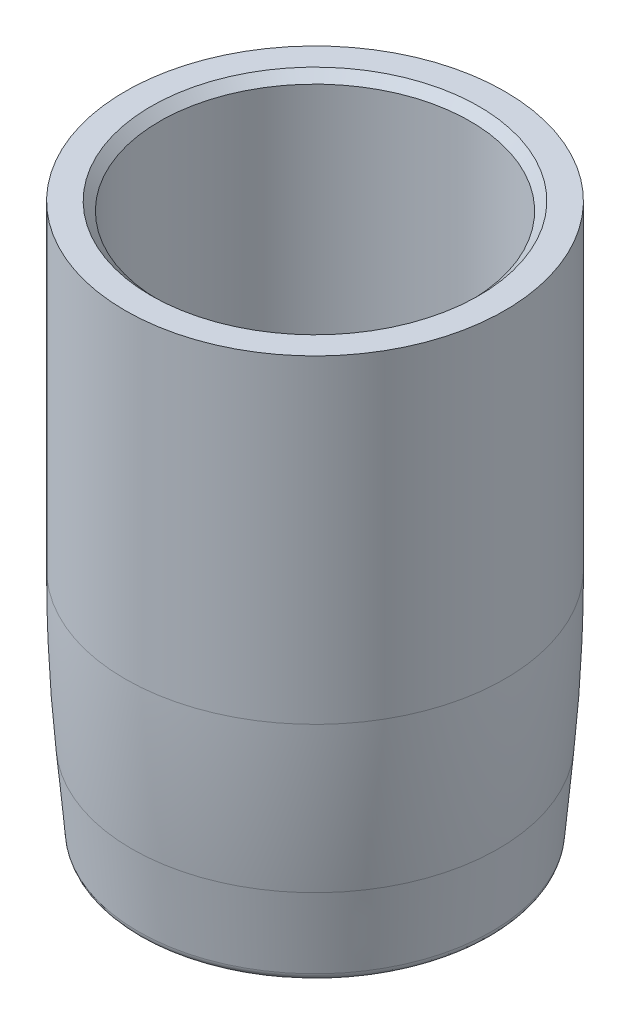
ISO-10303-21;
HEADER;
FILE_DESCRIPTION(('STEP AP214'),'2;1');
FILE_NAME('part.step','',(''),(''),'','','');
FILE_SCHEMA(('AUTOMOTIVE_DESIGN { 1 0 10303 214 1 1 1 1 }'));
ENDSEC;
DATA;
#1=APPLICATION_CONTEXT('core data for automotive mechanical design processes');
#2=APPLICATION_PROTOCOL_DEFINITION('international standard','automotive_design',2000,#1);
#3=PRODUCT_CONTEXT('',#1,'mechanical');
#4=PRODUCT('Part','Part','',(#3));
#5=PRODUCT_RELATED_PRODUCT_CATEGORY('part','',(#4));
#6=PRODUCT_DEFINITION_FORMATION('','',#4);
#7=PRODUCT_DEFINITION_CONTEXT('part definition',#1,'design');
#8=PRODUCT_DEFINITION('design','',#6,#7);
#9=PRODUCT_DEFINITION_SHAPE('','',#8);
#10=(LENGTH_UNIT() NAMED_UNIT(*) SI_UNIT(.MILLI.,.METRE.));
#11=(NAMED_UNIT(*) PLANE_ANGLE_UNIT() SI_UNIT($,.RADIAN.));
#12=(NAMED_UNIT(*) SI_UNIT($,.STERADIAN.) SOLID_ANGLE_UNIT());
#13=UNCERTAINTY_MEASURE_WITH_UNIT(LENGTH_MEASURE(1.E-05),#10,'distance_accuracy_value','');
#14=(GEOMETRIC_REPRESENTATION_CONTEXT(3) GLOBAL_UNCERTAINTY_ASSIGNED_CONTEXT((#13)) GLOBAL_UNIT_ASSIGNED_CONTEXT((#10,
#11,#12)) REPRESENTATION_CONTEXT('',''));
#15=CARTESIAN_POINT('',(0.,0.,0.));
#16=DIRECTION('',(0.,0.,1.));
#17=DIRECTION('',(1.,0.,0.));
#18=AXIS2_PLACEMENT_3D('',#15,#16,#17);
#19=CARTESIAN_POINT('',(0.,2.,0.));
#20=DIRECTION('',(0.,1.,0.));
#21=DIRECTION('',(0.,0.,1.));
#22=AXIS2_PLACEMENT_3D('',#19,#20,#21);
#23=PLANE('',#22);
#24=CARTESIAN_POINT('',(0.,2.,0.));
#25=DIRECTION('',(0.,1.,0.));
#26=DIRECTION('',(0.,0.,1.));
#27=AXIS2_PLACEMENT_3D('',#24,#25,#26);
#28=CIRCLE('',#27,5.50000000000001);
#29=CARTESIAN_POINT('',(0.,2.,5.50000000000001));
#30=VERTEX_POINT('',#29);
#31=EDGE_CURVE('E10',#30,#30,#28,.F.);
#32=ORIENTED_EDGE('',*,*,#31,.T.);
#33=EDGE_LOOP('',(#32));
#34=FACE_BOUND('',#33,.T.);
#35=CARTESIAN_POINT('',(0.,2.,0.));
#36=DIRECTION('',(0.,1.,0.));
#37=DIRECTION('',(0.,0.,1.));
#38=AXIS2_PLACEMENT_3D('',#35,#36,#37);
#39=CIRCLE('',#38,9.);
#40=CARTESIAN_POINT('',(0.,2.,9.));
#41=VERTEX_POINT('',#40);
#42=EDGE_CURVE('E86',#41,#41,#39,.F.);
#43=ORIENTED_EDGE('',*,*,#42,.F.);
#44=EDGE_LOOP('',(#43));
#45=FACE_BOUND('',#44,.T.);
#46=ADVANCED_FACE('F45',(#34,#45),#23,.T.);
#47=CARTESIAN_POINT('',(0.,0.,0.));
#48=DIRECTION('',(0.,1.,0.));
#49=DIRECTION('',(0.,0.,1.));
#50=AXIS2_PLACEMENT_3D('',#47,#48,#49);
#51=PLANE('',#50);
#52=CARTESIAN_POINT('',(0.,0.,0.));
#53=DIRECTION('',(0.,1.,0.));
#54=DIRECTION('',(0.,0.,1.));
#55=AXIS2_PLACEMENT_3D('',#52,#53,#54);
#56=CIRCLE('',#55,9.74183441299132);
#57=CARTESIAN_POINT('',(0.,0.,9.74183441299132));
#58=VERTEX_POINT('',#57);
#59=EDGE_CURVE('E74',#58,#58,#56,.F.);
#60=ORIENTED_EDGE('',*,*,#59,.T.);
#61=EDGE_LOOP('',(#60));
#62=FACE_BOUND('',#61,.T.);
#63=CARTESIAN_POINT('',(0.,0.,0.));
#64=DIRECTION('',(0.,1.,0.));
#65=DIRECTION('',(0.,0.,1.));
#66=AXIS2_PLACEMENT_3D('',#63,#64,#65);
#67=CIRCLE('',#66,5.);
#68=CARTESIAN_POINT('',(0.,0.,5.));
#69=VERTEX_POINT('',#68);
#70=EDGE_CURVE('E90',#69,#69,#67,.T.);
#71=ORIENTED_EDGE('',*,*,#70,.T.);
#72=EDGE_LOOP('',(#71));
#73=FACE_BOUND('',#72,.T.);
#74=ADVANCED_FACE('F104',(#62,#73),#51,.F.);
#75=CARTESIAN_POINT('',(0.,2.,0.));
#76=DIRECTION('',(0.,-1.,0.));
#77=DIRECTION('',(0.,0.,-1.));
#78=AXIS2_PLACEMENT_3D('',#75,#76,#77);
#79=CYLINDRICAL_SURFACE('',#78,11.);
#80=CARTESIAN_POINT('',(0.,13.51013613306,0.));
#81=DIRECTION('',(0.,-1.,0.));
#82=DIRECTION('',(0.,0.,-1.));
#83=AXIS2_PLACEMENT_3D('',#80,#81,#82);
#84=CIRCLE('',#83,11.);
#85=CARTESIAN_POINT('',(0.,13.51013613306,-11.));
#86=VERTEX_POINT('',#85);
#87=EDGE_CURVE('E64',#86,#86,#84,.F.);
#88=ORIENTED_EDGE('',*,*,#87,.T.);
#89=EDGE_LOOP('',(#88));
#90=FACE_BOUND('',#89,.T.);
#91=CARTESIAN_POINT('',(0.,32.,0.));
#92=DIRECTION('',(0.,1.,0.));
#93=DIRECTION('',(0.,0.,1.));
#94=AXIS2_PLACEMENT_3D('',#91,#92,#93);
#95=CIRCLE('',#94,11.);
#96=CARTESIAN_POINT('',(0.,32.,11.));
#97=VERTEX_POINT('',#96);
#98=EDGE_CURVE('E94',#97,#97,#95,.T.);
#99=ORIENTED_EDGE('',*,*,#98,.F.);
#100=EDGE_LOOP('',(#99));
#101=FACE_BOUND('',#100,.T.);
#102=ADVANCED_FACE('F101',(#90,#101),#79,.T.);
#103=CARTESIAN_POINT('',(0.,2.,0.));
#104=DIRECTION('',(0.,-1.,0.));
#105=DIRECTION('',(0.,0.,-1.));
#106=AXIS2_PLACEMENT_3D('',#103,#104,#105);
#107=CYLINDRICAL_SURFACE('',#106,5.);
#108=CARTESIAN_POINT('',(0.,1.50000000000001,0.));
#109=DIRECTION('',(0.,1.,0.));
#110=DIRECTION('',(0.,0.,1.));
#111=AXIS2_PLACEMENT_3D('',#108,#109,#110);
#112=CIRCLE('',#111,5.);
#113=CARTESIAN_POINT('',(0.,1.50000000000001,5.));
#114=VERTEX_POINT('',#113);
#115=EDGE_CURVE('E54',#114,#114,#112,.T.);
#116=ORIENTED_EDGE('',*,*,#115,.T.);
#117=EDGE_LOOP('',(#116));
#118=FACE_BOUND('',#117,.T.);
#119=ORIENTED_EDGE('',*,*,#70,.F.);
#120=EDGE_LOOP('',(#119));
#121=FACE_BOUND('',#120,.T.);
#122=ADVANCED_FACE('F103',(#118,#121),#107,.F.);
#123=CARTESIAN_POINT('',(0.,32.,0.));
#124=DIRECTION('',(0.,1.,0.));
#125=DIRECTION('',(0.,0.,1.));
#126=AXIS2_PLACEMENT_3D('',#123,#124,#125);
#127=PLANE('',#126);
#128=CARTESIAN_POINT('',(0.,32.,0.));
#129=DIRECTION('',(0.,1.,0.));
#130=DIRECTION('',(0.,0.,1.));
#131=AXIS2_PLACEMENT_3D('',#128,#129,#130);
#132=CIRCLE('',#131,9.50000000000001);
#133=CARTESIAN_POINT('',(0.,32.,9.50000000000001));
#134=VERTEX_POINT('',#133);
#135=EDGE_CURVE('E78',#134,#134,#132,.F.);
#136=ORIENTED_EDGE('',*,*,#135,.T.);
#137=EDGE_LOOP('',(#136));
#138=FACE_BOUND('',#137,.T.);
#139=ORIENTED_EDGE('',*,*,#98,.T.);
#140=EDGE_LOOP('',(#139));
#141=FACE_BOUND('',#140,.T.);
#142=ADVANCED_FACE('F99',(#138,#141),#127,.T.);
#143=CARTESIAN_POINT('',(0.,32.,0.));
#144=DIRECTION('',(0.,-1.,0.));
#145=DIRECTION('',(0.,0.,-1.));
#146=AXIS2_PLACEMENT_3D('',#143,#144,#145);
#147=CYLINDRICAL_SURFACE('',#146,9.);
#148=CARTESIAN_POINT('',(0.,31.5,0.));
#149=DIRECTION('',(0.,1.,0.));
#150=DIRECTION('',(0.,0.,1.));
#151=AXIS2_PLACEMENT_3D('',#148,#149,#150);
#152=CIRCLE('',#151,9.);
#153=CARTESIAN_POINT('',(0.,31.5,9.));
#154=VERTEX_POINT('',#153);
#155=EDGE_CURVE('E82',#154,#154,#152,.T.);
#156=ORIENTED_EDGE('',*,*,#155,.T.);
#157=EDGE_LOOP('',(#156));
#158=FACE_BOUND('',#157,.T.);
#159=ORIENTED_EDGE('',*,*,#42,.T.);
#160=EDGE_LOOP('',(#159));
#161=FACE_BOUND('',#160,.T.);
#162=ADVANCED_FACE('F126',(#158,#161),#147,.F.);
#163=CARTESIAN_POINT('',(0.,9.14404184220863,0.));
#164=DIRECTION('',(0.,1.,0.));
#165=DIRECTION('',(0.,0.,1.));
#166=AXIS2_PLACEMENT_3D('',#163,#164,#165);
#167=CONICAL_SURFACE('',#166,11.,0.0872664625997168);
#168=CARTESIAN_POINT('',(0.,4.7945618582941,0.));
#169=DIRECTION('',(0.,1.,0.));
#170=DIRECTION('',(0.,0.,1.));
#171=AXIS2_PLACEMENT_3D('',#168,#169,#170);
#172=CIRCLE('',#171,10.6194698091746);
#173=CARTESIAN_POINT('',(0.,4.7945618582941,10.6194698091746));
#174=VERTEX_POINT('',#173);
#175=EDGE_CURVE('E59',#174,#174,#172,.F.);
#176=ORIENTED_EDGE('',*,*,#175,.T.);
#177=EDGE_LOOP('',(#176));
#178=FACE_BOUND('',#177,.T.);
#179=CARTESIAN_POINT('',(0.,0.456422128626171,0.));
#180=DIRECTION('',(0.,1.,0.));
#181=DIRECTION('',(0.,0.,1.));
#182=AXIS2_PLACEMENT_3D('',#179,#180,#181);
#183=CIRCLE('',#182,10.2399317620372);
#184=CARTESIAN_POINT('',(0.,0.456422128626171,10.2399317620372));
#185=VERTEX_POINT('',#184);
#186=EDGE_CURVE('E70',#185,#185,#183,.T.);
#187=ORIENTED_EDGE('',*,*,#186,.T.);
#188=EDGE_LOOP('',(#187));
#189=FACE_BOUND('',#188,.T.);
#190=ADVANCED_FACE('F129',(#178,#189),#167,.T.);
#191=CARTESIAN_POINT('',(0.,31.5,0.));
#192=DIRECTION('',(0.,1.,0.));
#193=DIRECTION('',(0.,0.,1.));
#194=AXIS2_PLACEMENT_3D('',#191,#192,#193);
#195=CONICAL_SURFACE('',#194,9.,0.78539816339745);
#196=ORIENTED_EDGE('',*,*,#135,.F.);
#197=EDGE_LOOP('',(#196));
#198=FACE_BOUND('',#197,.T.);
#199=ORIENTED_EDGE('',*,*,#155,.F.);
#200=EDGE_LOOP('',(#199));
#201=FACE_BOUND('',#200,.T.);
#202=ADVANCED_FACE('F134',(#198,#201),#195,.F.);
#203=CARTESIAN_POINT('',(0.,0.5,0.));
#204=DIRECTION('',(0.,1.,0.));
#205=DIRECTION('',(0.,0.,1.));
#206=AXIS2_PLACEMENT_3D('',#203,#204,#205);
#207=TOROIDAL_SURFACE('',#206,9.74183441299132,0.5);
#208=ORIENTED_EDGE('',*,*,#186,.F.);
#209=EDGE_LOOP('',(#208));
#210=FACE_BOUND('',#209,.T.);
#211=ORIENTED_EDGE('',*,*,#59,.F.);
#212=EDGE_LOOP('',(#211));
#213=FACE_BOUND('',#212,.T.);
#214=ADVANCED_FACE('F140',(#210,#213),#207,.T.);
#215=CARTESIAN_POINT('',(0.,13.51013613306,0.));
#216=DIRECTION('',(0.,-1.,0.));
#217=DIRECTION('',(0.,0.,-1.));
#218=AXIS2_PLACEMENT_3D('',#215,#216,#217);
#219=DEGENERATE_TOROIDAL_SURFACE('',#218,89.,100.,.F.);
#220=ORIENTED_EDGE('',*,*,#175,.F.);
#221=EDGE_LOOP('',(#220));
#222=FACE_BOUND('',#221,.T.);
#223=ORIENTED_EDGE('',*,*,#87,.F.);
#224=EDGE_LOOP('',(#223));
#225=FACE_BOUND('',#224,.T.);
#226=ADVANCED_FACE('F145',(#222,#225),#219,.F.);
#227=CARTESIAN_POINT('',(0.,1.50000000000001,0.));
#228=DIRECTION('',(0.,1.,0.));
#229=DIRECTION('',(0.,0.,1.));
#230=AXIS2_PLACEMENT_3D('',#227,#228,#229);
#231=CONICAL_SURFACE('',#230,5.,0.785398163397459);
#232=ORIENTED_EDGE('',*,*,#31,.F.);
#233=EDGE_LOOP('',(#232));
#234=FACE_BOUND('',#233,.T.);
#235=ORIENTED_EDGE('',*,*,#115,.F.);
#236=EDGE_LOOP('',(#235));
#237=FACE_BOUND('',#236,.T.);
#238=ADVANCED_FACE('F48',(#234,#237),#231,.F.);
#239=CLOSED_SHELL('',(#46,#74,#102,#122,#142,#162,#190,#202,#214,#226,#238));
#240=MANIFOLD_SOLID_BREP('B2',#239);
#241=ADVANCED_BREP_SHAPE_REPRESENTATION('',(#18,#240),#14);
#242=SHAPE_DEFINITION_REPRESENTATION(#9,#241);
ENDSEC;
END-ISO-10303-21;
